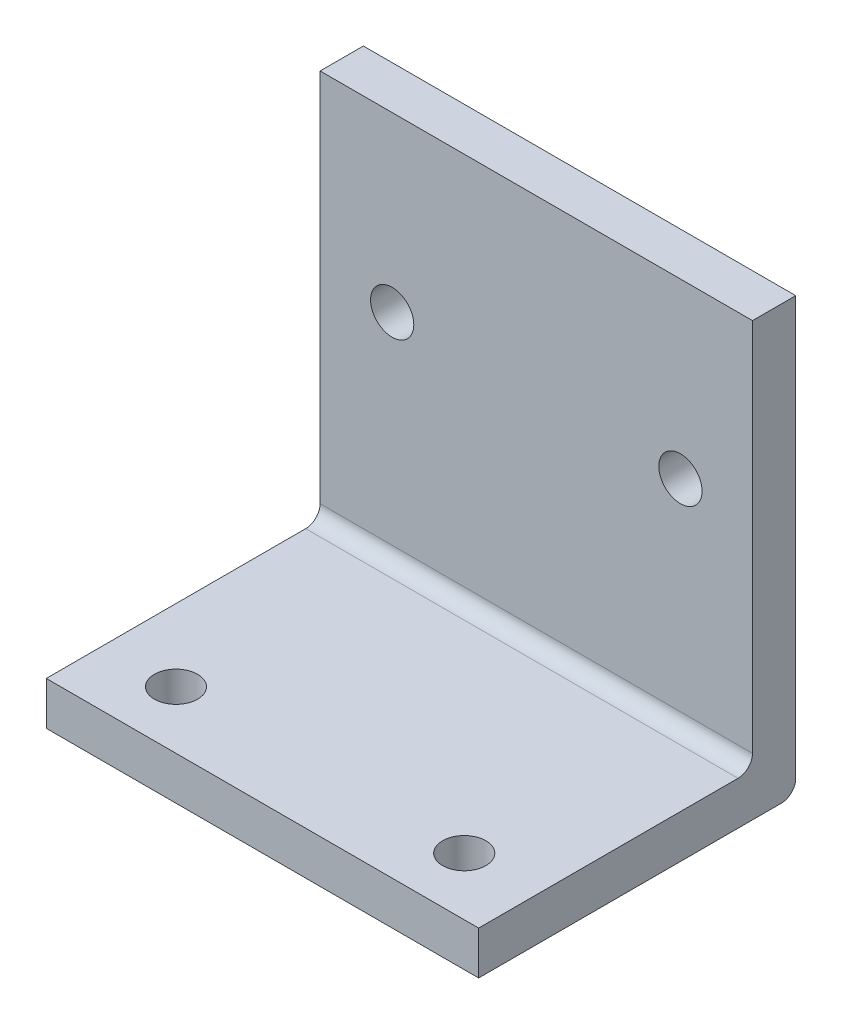
ISO-10303-21;
HEADER;
FILE_DESCRIPTION(('STEP AP214'),'2;1');
FILE_NAME('part.step','',(''),(''),'','','');
FILE_SCHEMA(('AUTOMOTIVE_DESIGN { 1 0 10303 214 1 1 1 1 }'));
ENDSEC;
DATA;
#1=APPLICATION_CONTEXT('core data for automotive mechanical design processes');
#2=APPLICATION_PROTOCOL_DEFINITION('international standard','automotive_design',2000,#1);
#3=PRODUCT_CONTEXT('',#1,'mechanical');
#4=PRODUCT('Part','Part','',(#3));
#5=PRODUCT_RELATED_PRODUCT_CATEGORY('part','',(#4));
#6=PRODUCT_DEFINITION_FORMATION('','',#4);
#7=PRODUCT_DEFINITION_CONTEXT('part definition',#1,'design');
#8=PRODUCT_DEFINITION('design','',#6,#7);
#9=PRODUCT_DEFINITION_SHAPE('','',#8);
#10=(LENGTH_UNIT() NAMED_UNIT(*) SI_UNIT(.MILLI.,.METRE.));
#11=(NAMED_UNIT(*) PLANE_ANGLE_UNIT() SI_UNIT($,.RADIAN.));
#12=(NAMED_UNIT(*) SI_UNIT($,.STERADIAN.) SOLID_ANGLE_UNIT());
#13=UNCERTAINTY_MEASURE_WITH_UNIT(LENGTH_MEASURE(1.E-05),#10,'distance_accuracy_value','');
#14=(GEOMETRIC_REPRESENTATION_CONTEXT(3) GLOBAL_UNCERTAINTY_ASSIGNED_CONTEXT((#13)) GLOBAL_UNIT_ASSIGNED_CONTEXT((#10,
#11,#12)) REPRESENTATION_CONTEXT('',''));
#15=CARTESIAN_POINT('',(0.,0.,0.));
#16=DIRECTION('',(0.,0.,1.));
#17=DIRECTION('',(1.,0.,0.));
#18=AXIS2_PLACEMENT_3D('',#15,#16,#17);
#19=CARTESIAN_POINT('',(-15.,-15.,3.));
#20=DIRECTION('',(1.,0.,0.));
#21=DIRECTION('',(0.,0.,-1.));
#22=AXIS2_PLACEMENT_3D('',#19,#20,#21);
#23=PLANE('',#22);
#24=DIRECTION('',(0.,0.,-1.));
#25=VECTOR('',#24,1.);
#26=CARTESIAN_POINT('',(-15.,-15.,3.));
#27=LINE('',#26,#25);
#28=CARTESIAN_POINT('',(-15.,-15.,22.));
#29=VERTEX_POINT('',#28);
#30=CARTESIAN_POINT('',(-15.,-15.,1.));
#31=VERTEX_POINT('',#30);
#32=EDGE_CURVE('E120',#29,#31,#27,.T.);
#33=ORIENTED_EDGE('',*,*,#32,.F.);
#34=DIRECTION('',(0.,1.,0.));
#35=VECTOR('',#34,1.);
#36=CARTESIAN_POINT('',(-15.,-22.,22.));
#37=LINE('',#36,#35);
#38=CARTESIAN_POINT('',(-15.,-12.,22.));
#39=VERTEX_POINT('',#38);
#40=EDGE_CURVE('E109',#29,#39,#37,.T.);
#41=ORIENTED_EDGE('',*,*,#40,.T.);
#42=DIRECTION('',(0.,0.,-1.));
#43=VECTOR('',#42,1.);
#44=CARTESIAN_POINT('',(-15.,-12.,30.));
#45=LINE('',#44,#43);
#46=CARTESIAN_POINT('',(-15.,-12.,4.));
#47=VERTEX_POINT('',#46);
#48=EDGE_CURVE('E118',#39,#47,#45,.T.);
#49=ORIENTED_EDGE('',*,*,#48,.T.);
#50=CARTESIAN_POINT('',(-15.,-11.,4.));
#51=DIRECTION('',(1.,0.,0.));
#52=DIRECTION('',(0.,0.,-1.));
#53=AXIS2_PLACEMENT_3D('',#50,#51,#52);
#54=CIRCLE('',#53,1.);
#55=CARTESIAN_POINT('',(-15.,-11.,3.));
#56=VERTEX_POINT('',#55);
#57=EDGE_CURVE('E193',#47,#56,#54,.T.);
#58=ORIENTED_EDGE('',*,*,#57,.T.);
#59=DIRECTION('',(0.,-1.,0.));
#60=VECTOR('',#59,1.);
#61=CARTESIAN_POINT('',(-15.,-15.,3.));
#62=LINE('',#61,#60);
#63=CARTESIAN_POINT('',(-15.,15.,3.));
#64=VERTEX_POINT('',#63);
#65=EDGE_CURVE('E149',#64,#56,#62,.T.);
#66=ORIENTED_EDGE('',*,*,#65,.F.);
#67=DIRECTION('',(0.,0.,-1.));
#68=VECTOR('',#67,1.);
#69=CARTESIAN_POINT('',(-15.,15.,3.));
#70=LINE('',#69,#68);
#71=CARTESIAN_POINT('',(-15.,15.,0.));
#72=VERTEX_POINT('',#71);
#73=EDGE_CURVE('E160',#64,#72,#70,.T.);
#74=ORIENTED_EDGE('',*,*,#73,.T.);
#75=DIRECTION('',(0.,-1.,0.));
#76=VECTOR('',#75,1.);
#77=CARTESIAN_POINT('',(-15.,-15.,0.));
#78=LINE('',#77,#76);
#79=CARTESIAN_POINT('',(-15.,-14.,0.));
#80=VERTEX_POINT('',#79);
#81=EDGE_CURVE('E161',#72,#80,#78,.T.);
#82=ORIENTED_EDGE('',*,*,#81,.T.);
#83=CARTESIAN_POINT('',(-15.,-14.,1.));
#84=DIRECTION('',(1.,0.,0.));
#85=DIRECTION('',(0.,0.,-1.));
#86=AXIS2_PLACEMENT_3D('',#83,#84,#85);
#87=CIRCLE('',#86,1.);
#88=EDGE_CURVE('E11',#80,#31,#87,.F.);
#89=ORIENTED_EDGE('',*,*,#88,.T.);
#90=EDGE_LOOP('',(#33,#41,#49,#58,#66,#74,#82,#89));
#91=FACE_BOUND('',#90,.T.);
#92=ADVANCED_FACE('F42',(#91),#23,.F.);
#93=CARTESIAN_POINT('',(15.,-15.,3.));
#94=DIRECTION('',(0.,1.,0.));
#95=DIRECTION('',(-1.,0.,0.));
#96=AXIS2_PLACEMENT_3D('',#93,#94,#95);
#97=PLANE('',#96);
#98=CARTESIAN_POINT('',(10.,-15.,18.));
#99=DIRECTION('',(0.,1.,0.));
#100=DIRECTION('',(-1.,0.,0.));
#101=AXIS2_PLACEMENT_3D('',#98,#99,#100);
#102=CIRCLE('',#101,1.5);
#103=CARTESIAN_POINT('',(8.5,-15.,18.));
#104=VERTEX_POINT('',#103);
#105=EDGE_CURVE('E130',#104,#104,#102,.T.);
#106=ORIENTED_EDGE('',*,*,#105,.T.);
#107=EDGE_LOOP('',(#106));
#108=FACE_BOUND('',#107,.T.);
#109=CARTESIAN_POINT('',(-10.,-15.,18.));
#110=DIRECTION('',(0.,1.,0.));
#111=DIRECTION('',(-1.,0.,0.));
#112=AXIS2_PLACEMENT_3D('',#109,#110,#111);
#113=CIRCLE('',#112,1.5);
#114=CARTESIAN_POINT('',(-11.5,-15.,18.));
#115=VERTEX_POINT('',#114);
#116=EDGE_CURVE('E137',#115,#115,#113,.T.);
#117=ORIENTED_EDGE('',*,*,#116,.T.);
#118=EDGE_LOOP('',(#117));
#119=FACE_BOUND('',#118,.T.);
#120=DIRECTION('',(0.,0.,-1.));
#121=VECTOR('',#120,1.);
#122=CARTESIAN_POINT('',(15.,-15.,3.));
#123=LINE('',#122,#121);
#124=CARTESIAN_POINT('',(15.,-15.,22.));
#125=VERTEX_POINT('',#124);
#126=CARTESIAN_POINT('',(15.,-15.,1.));
#127=VERTEX_POINT('',#126);
#128=EDGE_CURVE('E177',#125,#127,#123,.T.);
#129=ORIENTED_EDGE('',*,*,#128,.F.);
#130=DIRECTION('',(-1.,0.,0.));
#131=VECTOR('',#130,1.);
#132=CARTESIAN_POINT('',(15.,-15.,22.));
#133=LINE('',#132,#131);
#134=EDGE_CURVE('E122',#125,#29,#133,.T.);
#135=ORIENTED_EDGE('',*,*,#134,.T.);
#136=ORIENTED_EDGE('',*,*,#32,.T.);
#137=DIRECTION('',(1.,0.,0.));
#138=VECTOR('',#137,1.);
#139=CARTESIAN_POINT('',(15.,-15.,1.));
#140=LINE('',#139,#138);
#141=EDGE_CURVE('E200',#31,#127,#140,.T.);
#142=ORIENTED_EDGE('',*,*,#141,.T.);
#143=EDGE_LOOP('',(#129,#135,#136,#142));
#144=FACE_BOUND('',#143,.T.);
#145=ADVANCED_FACE('F250',(#108,#119,#144),#97,.F.);
#146=CARTESIAN_POINT('',(15.,-15.,3.));
#147=DIRECTION('',(-1.,0.,0.));
#148=DIRECTION('',(0.,-1.,0.));
#149=AXIS2_PLACEMENT_3D('',#146,#147,#148);
#150=PLANE('',#149);
#151=DIRECTION('',(0.,0.,-1.));
#152=VECTOR('',#151,1.);
#153=CARTESIAN_POINT('',(15.,-12.,30.));
#154=LINE('',#153,#152);
#155=CARTESIAN_POINT('',(15.,-12.,22.));
#156=VERTEX_POINT('',#155);
#157=CARTESIAN_POINT('',(15.,-12.,4.));
#158=VERTEX_POINT('',#157);
#159=EDGE_CURVE('E129',#156,#158,#154,.T.);
#160=ORIENTED_EDGE('',*,*,#159,.F.);
#161=DIRECTION('',(0.,1.,0.));
#162=VECTOR('',#161,1.);
#163=CARTESIAN_POINT('',(15.,-22.,22.));
#164=LINE('',#163,#162);
#165=EDGE_CURVE('E58',#125,#156,#164,.T.);
#166=ORIENTED_EDGE('',*,*,#165,.F.);
#167=ORIENTED_EDGE('',*,*,#128,.T.);
#168=CARTESIAN_POINT('',(15.,-14.,1.));
#169=DIRECTION('',(-1.,0.,0.));
#170=DIRECTION('',(0.,-1.,0.));
#171=AXIS2_PLACEMENT_3D('',#168,#169,#170);
#172=CIRCLE('',#171,1.);
#173=CARTESIAN_POINT('',(15.,-14.,0.));
#174=VERTEX_POINT('',#173);
#175=EDGE_CURVE('E204',#127,#174,#172,.F.);
#176=ORIENTED_EDGE('',*,*,#175,.T.);
#177=DIRECTION('',(0.,1.,0.));
#178=VECTOR('',#177,1.);
#179=CARTESIAN_POINT('',(15.,-15.,0.));
#180=LINE('',#179,#178);
#181=CARTESIAN_POINT('',(15.,15.,0.));
#182=VERTEX_POINT('',#181);
#183=EDGE_CURVE('E164',#174,#182,#180,.T.);
#184=ORIENTED_EDGE('',*,*,#183,.T.);
#185=DIRECTION('',(0.,0.,-1.));
#186=VECTOR('',#185,1.);
#187=CARTESIAN_POINT('',(15.,15.,3.));
#188=LINE('',#187,#186);
#189=CARTESIAN_POINT('',(15.,15.,3.));
#190=VERTEX_POINT('',#189);
#191=EDGE_CURVE('E173',#190,#182,#188,.T.);
#192=ORIENTED_EDGE('',*,*,#191,.F.);
#193=DIRECTION('',(0.,1.,0.));
#194=VECTOR('',#193,1.);
#195=CARTESIAN_POINT('',(15.,-15.,3.));
#196=LINE('',#195,#194);
#197=CARTESIAN_POINT('',(15.,-11.,3.));
#198=VERTEX_POINT('',#197);
#199=EDGE_CURVE('E153',#198,#190,#196,.T.);
#200=ORIENTED_EDGE('',*,*,#199,.F.);
#201=CARTESIAN_POINT('',(15.,-11.,4.));
#202=DIRECTION('',(-1.,0.,0.));
#203=DIRECTION('',(0.,-1.,0.));
#204=AXIS2_PLACEMENT_3D('',#201,#202,#203);
#205=CIRCLE('',#204,1.);
#206=EDGE_CURVE('E196',#198,#158,#205,.T.);
#207=ORIENTED_EDGE('',*,*,#206,.T.);
#208=EDGE_LOOP('',(#160,#166,#167,#176,#184,#192,#200,#207));
#209=FACE_BOUND('',#208,.T.);
#210=ADVANCED_FACE('F209',(#209),#150,.F.);
#211=CARTESIAN_POINT('',(15.,15.,3.));
#212=DIRECTION('',(0.,-1.,0.));
#213=DIRECTION('',(0.,0.,-1.));
#214=AXIS2_PLACEMENT_3D('',#211,#212,#213);
#215=PLANE('',#214);
#216=DIRECTION('',(-1.,0.,0.));
#217=VECTOR('',#216,1.);
#218=CARTESIAN_POINT('',(15.,15.,0.));
#219=LINE('',#218,#217);
#220=EDGE_CURVE('E154',#182,#72,#219,.T.);
#221=ORIENTED_EDGE('',*,*,#220,.T.);
#222=ORIENTED_EDGE('',*,*,#73,.F.);
#223=DIRECTION('',(-1.,0.,0.));
#224=VECTOR('',#223,1.);
#225=CARTESIAN_POINT('',(15.,15.,3.));
#226=LINE('',#225,#224);
#227=EDGE_CURVE('E157',#190,#64,#226,.T.);
#228=ORIENTED_EDGE('',*,*,#227,.F.);
#229=ORIENTED_EDGE('',*,*,#191,.T.);
#230=EDGE_LOOP('',(#221,#222,#228,#229));
#231=FACE_BOUND('',#230,.T.);
#232=ADVANCED_FACE('F221',(#231),#215,.F.);
#233=CARTESIAN_POINT('',(0.,0.,3.));
#234=DIRECTION('',(0.,0.,1.));
#235=DIRECTION('',(1.,0.,0.));
#236=AXIS2_PLACEMENT_3D('',#233,#234,#235);
#237=PLANE('',#236);
#238=ORIENTED_EDGE('',*,*,#65,.T.);
#239=DIRECTION('',(-1.,0.,0.));
#240=VECTOR('',#239,1.);
#241=CARTESIAN_POINT('',(0.,-11.,3.));
#242=LINE('',#241,#240);
#243=EDGE_CURVE('E190',#56,#198,#242,.F.);
#244=ORIENTED_EDGE('',*,*,#243,.T.);
#245=ORIENTED_EDGE('',*,*,#199,.T.);
#246=ORIENTED_EDGE('',*,*,#227,.T.);
#247=EDGE_LOOP('',(#238,#244,#245,#246));
#248=FACE_BOUND('',#247,.T.);
#249=CARTESIAN_POINT('',(10.,3.,3.));
#250=DIRECTION('',(0.,0.,1.));
#251=DIRECTION('',(1.,0.,0.));
#252=AXIS2_PLACEMENT_3D('',#249,#250,#251);
#253=CIRCLE('',#252,1.5);
#254=CARTESIAN_POINT('',(11.5,3.,3.));
#255=VERTEX_POINT('',#254);
#256=EDGE_CURVE('E141',#255,#255,#253,.T.);
#257=ORIENTED_EDGE('',*,*,#256,.F.);
#258=EDGE_LOOP('',(#257));
#259=FACE_BOUND('',#258,.T.);
#260=CARTESIAN_POINT('',(-10.,3.,3.));
#261=DIRECTION('',(0.,0.,1.));
#262=DIRECTION('',(1.,0.,0.));
#263=AXIS2_PLACEMENT_3D('',#260,#261,#262);
#264=CIRCLE('',#263,1.5);
#265=CARTESIAN_POINT('',(-8.5,3.,3.));
#266=VERTEX_POINT('',#265);
#267=EDGE_CURVE('E134',#266,#266,#264,.T.);
#268=ORIENTED_EDGE('',*,*,#267,.F.);
#269=EDGE_LOOP('',(#268));
#270=FACE_BOUND('',#269,.T.);
#271=ADVANCED_FACE('F228',(#248,#259,#270),#237,.T.);
#272=CARTESIAN_POINT('',(0.,0.,0.));
#273=DIRECTION('',(0.,0.,1.));
#274=DIRECTION('',(1.,0.,0.));
#275=AXIS2_PLACEMENT_3D('',#272,#273,#274);
#276=PLANE('',#275);
#277=CARTESIAN_POINT('',(10.,3.,0.));
#278=DIRECTION('',(0.,0.,1.));
#279=DIRECTION('',(1.,0.,0.));
#280=AXIS2_PLACEMENT_3D('',#277,#278,#279);
#281=CIRCLE('',#280,1.5);
#282=CARTESIAN_POINT('',(11.5,3.,0.));
#283=VERTEX_POINT('',#282);
#284=EDGE_CURVE('E165',#283,#283,#281,.T.);
#285=ORIENTED_EDGE('',*,*,#284,.T.);
#286=EDGE_LOOP('',(#285));
#287=FACE_BOUND('',#286,.T.);
#288=CARTESIAN_POINT('',(-10.,3.,0.));
#289=DIRECTION('',(0.,0.,1.));
#290=DIRECTION('',(1.,0.,0.));
#291=AXIS2_PLACEMENT_3D('',#288,#289,#290);
#292=CIRCLE('',#291,1.5);
#293=CARTESIAN_POINT('',(-8.5,3.,0.));
#294=VERTEX_POINT('',#293);
#295=EDGE_CURVE('E145',#294,#294,#292,.T.);
#296=ORIENTED_EDGE('',*,*,#295,.T.);
#297=EDGE_LOOP('',(#296));
#298=FACE_BOUND('',#297,.T.);
#299=ORIENTED_EDGE('',*,*,#183,.F.);
#300=DIRECTION('',(1.,0.,0.));
#301=VECTOR('',#300,1.);
#302=CARTESIAN_POINT('',(0.,-14.,0.));
#303=LINE('',#302,#301);
#304=EDGE_CURVE('E51',#174,#80,#303,.F.);
#305=ORIENTED_EDGE('',*,*,#304,.T.);
#306=ORIENTED_EDGE('',*,*,#81,.F.);
#307=ORIENTED_EDGE('',*,*,#220,.F.);
#308=EDGE_LOOP('',(#299,#305,#306,#307));
#309=FACE_BOUND('',#308,.T.);
#310=ADVANCED_FACE('F215',(#287,#298,#309),#276,.F.);
#311=CARTESIAN_POINT('',(-10.,3.,-0.5));
#312=DIRECTION('',(0.,0.,1.));
#313=DIRECTION('',(1.,0.,0.));
#314=AXIS2_PLACEMENT_3D('',#311,#312,#313);
#315=CYLINDRICAL_SURFACE('',#314,1.5);
#316=ORIENTED_EDGE('',*,*,#267,.T.);
#317=EDGE_LOOP('',(#316));
#318=FACE_BOUND('',#317,.T.);
#319=ORIENTED_EDGE('',*,*,#295,.F.);
#320=EDGE_LOOP('',(#319));
#321=FACE_BOUND('',#320,.T.);
#322=ADVANCED_FACE('F236',(#318,#321),#315,.F.);
#323=CARTESIAN_POINT('',(10.,3.,-0.5));
#324=DIRECTION('',(0.,0.,1.));
#325=DIRECTION('',(1.,0.,0.));
#326=AXIS2_PLACEMENT_3D('',#323,#324,#325);
#327=CYLINDRICAL_SURFACE('',#326,1.5);
#328=ORIENTED_EDGE('',*,*,#256,.T.);
#329=EDGE_LOOP('',(#328));
#330=FACE_BOUND('',#329,.T.);
#331=ORIENTED_EDGE('',*,*,#284,.F.);
#332=EDGE_LOOP('',(#331));
#333=FACE_BOUND('',#332,.T.);
#334=ADVANCED_FACE('F239',(#330,#333),#327,.F.);
#335=CARTESIAN_POINT('',(-15.,-12.,30.));
#336=DIRECTION('',(0.,-1.,0.));
#337=DIRECTION('',(0.,0.,-1.));
#338=AXIS2_PLACEMENT_3D('',#335,#336,#337);
#339=PLANE('',#338);
#340=CARTESIAN_POINT('',(10.,-12.,18.));
#341=DIRECTION('',(0.,1.,0.));
#342=DIRECTION('',(0.,0.,1.));
#343=AXIS2_PLACEMENT_3D('',#340,#341,#342);
#344=CIRCLE('',#343,1.5);
#345=CARTESIAN_POINT('',(10.,-12.,19.5));
#346=VERTEX_POINT('',#345);
#347=EDGE_CURVE('E401',#346,#346,#344,.T.);
#348=ORIENTED_EDGE('',*,*,#347,.F.);
#349=EDGE_LOOP('',(#348));
#350=FACE_BOUND('',#349,.T.);
#351=CARTESIAN_POINT('',(-10.,-12.,18.));
#352=DIRECTION('',(0.,1.,0.));
#353=DIRECTION('',(0.,0.,1.));
#354=AXIS2_PLACEMENT_3D('',#351,#352,#353);
#355=CIRCLE('',#354,1.5);
#356=CARTESIAN_POINT('',(-10.,-12.,19.5));
#357=VERTEX_POINT('',#356);
#358=EDGE_CURVE('E404',#357,#357,#355,.T.);
#359=ORIENTED_EDGE('',*,*,#358,.F.);
#360=EDGE_LOOP('',(#359));
#361=FACE_BOUND('',#360,.T.);
#362=ORIENTED_EDGE('',*,*,#48,.F.);
#363=DIRECTION('',(-1.,0.,0.));
#364=VECTOR('',#363,1.);
#365=CARTESIAN_POINT('',(-15.,-12.,22.));
#366=LINE('',#365,#364);
#367=EDGE_CURVE('E106',#156,#39,#366,.T.);
#368=ORIENTED_EDGE('',*,*,#367,.F.);
#369=ORIENTED_EDGE('',*,*,#159,.T.);
#370=DIRECTION('',(-1.,0.,0.));
#371=VECTOR('',#370,1.);
#372=CARTESIAN_POINT('',(-15.,-12.,4.));
#373=LINE('',#372,#371);
#374=EDGE_CURVE('E127',#158,#47,#373,.T.);
#375=ORIENTED_EDGE('',*,*,#374,.T.);
#376=EDGE_LOOP('',(#362,#368,#369,#375));
#377=FACE_BOUND('',#376,.T.);
#378=ADVANCED_FACE('F125',(#350,#361,#377),#339,.F.);
#379=CARTESIAN_POINT('',(-10.,-39.,18.));
#380=DIRECTION('',(0.,1.,0.));
#381=DIRECTION('',(0.,0.,1.));
#382=AXIS2_PLACEMENT_3D('',#379,#380,#381);
#383=CYLINDRICAL_SURFACE('',#382,1.5);
#384=ORIENTED_EDGE('',*,*,#358,.T.);
#385=EDGE_LOOP('',(#384));
#386=FACE_BOUND('',#385,.T.);
#387=ORIENTED_EDGE('',*,*,#116,.F.);
#388=EDGE_LOOP('',(#387));
#389=FACE_BOUND('',#388,.T.);
#390=ADVANCED_FACE('F264',(#386,#389),#383,.F.);
#391=CARTESIAN_POINT('',(10.,-39.,18.));
#392=DIRECTION('',(0.,1.,0.));
#393=DIRECTION('',(0.,0.,1.));
#394=AXIS2_PLACEMENT_3D('',#391,#392,#393);
#395=CYLINDRICAL_SURFACE('',#394,1.5);
#396=ORIENTED_EDGE('',*,*,#347,.T.);
#397=EDGE_LOOP('',(#396));
#398=FACE_BOUND('',#397,.T.);
#399=ORIENTED_EDGE('',*,*,#105,.F.);
#400=EDGE_LOOP('',(#399));
#401=FACE_BOUND('',#400,.T.);
#402=ADVANCED_FACE('F259',(#398,#401),#395,.F.);
#403=CARTESIAN_POINT('',(-15.,-11.,4.));
#404=DIRECTION('',(-1.,0.,0.));
#405=DIRECTION('',(0.,0.,1.));
#406=AXIS2_PLACEMENT_3D('',#403,#404,#405);
#407=CYLINDRICAL_SURFACE('',#406,1.);
#408=ORIENTED_EDGE('',*,*,#206,.F.);
#409=ORIENTED_EDGE('',*,*,#243,.F.);
#410=ORIENTED_EDGE('',*,*,#57,.F.);
#411=ORIENTED_EDGE('',*,*,#374,.F.);
#412=EDGE_LOOP('',(#408,#409,#410,#411));
#413=FACE_BOUND('',#412,.T.);
#414=ADVANCED_FACE('F227',(#413),#407,.F.);
#415=CARTESIAN_POINT('',(15.,-14.,1.));
#416=DIRECTION('',(1.,0.,0.));
#417=DIRECTION('',(0.,1.,0.));
#418=AXIS2_PLACEMENT_3D('',#415,#416,#417);
#419=CYLINDRICAL_SURFACE('',#418,1.);
#420=ORIENTED_EDGE('',*,*,#88,.F.);
#421=ORIENTED_EDGE('',*,*,#304,.F.);
#422=ORIENTED_EDGE('',*,*,#175,.F.);
#423=ORIENTED_EDGE('',*,*,#141,.F.);
#424=EDGE_LOOP('',(#420,#421,#422,#423));
#425=FACE_BOUND('',#424,.T.);
#426=ADVANCED_FACE('F44',(#425),#419,.T.);
#427=CARTESIAN_POINT('',(-15.,-22.,22.));
#428=DIRECTION('',(0.,0.,-1.));
#429=DIRECTION('',(-1.,0.,0.));
#430=AXIS2_PLACEMENT_3D('',#427,#428,#429);
#431=PLANE('',#430);
#432=ORIENTED_EDGE('',*,*,#165,.T.);
#433=ORIENTED_EDGE('',*,*,#367,.T.);
#434=ORIENTED_EDGE('',*,*,#40,.F.);
#435=ORIENTED_EDGE('',*,*,#134,.F.);
#436=EDGE_LOOP('',(#432,#433,#434,#435));
#437=FACE_BOUND('',#436,.T.);
#438=ADVANCED_FACE('F108',(#437),#431,.F.);
#439=CLOSED_SHELL('',(#92,#145,#210,#232,#271,#310,#322,#334,#378,#390,#402,#414,#426,#438));
#440=MANIFOLD_SOLID_BREP('B2',#439);
#441=ADVANCED_BREP_SHAPE_REPRESENTATION('',(#18,#440),#14);
#442=SHAPE_DEFINITION_REPRESENTATION(#9,#441);
ENDSEC;
END-ISO-10303-21;
